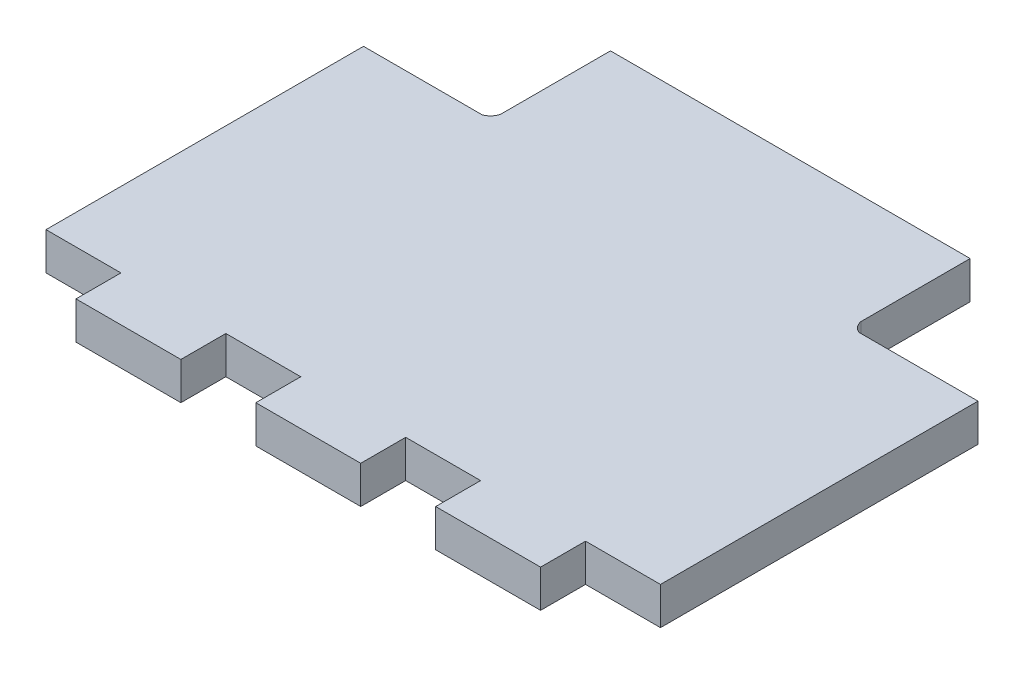
ISO-10303-21;
HEADER;
FILE_DESCRIPTION(('STEP AP214'),'2;1');
FILE_NAME('part.step','',(''),(''),'','','');
FILE_SCHEMA(('AUTOMOTIVE_DESIGN { 1 0 10303 214 1 1 1 1 }'));
ENDSEC;
DATA;
#1=APPLICATION_CONTEXT('core data for automotive mechanical design processes');
#2=APPLICATION_PROTOCOL_DEFINITION('international standard','automotive_design',2000,#1);
#3=PRODUCT_CONTEXT('',#1,'mechanical');
#4=PRODUCT('Part','Part','',(#3));
#5=PRODUCT_RELATED_PRODUCT_CATEGORY('part','',(#4));
#6=PRODUCT_DEFINITION_FORMATION('','',#4);
#7=PRODUCT_DEFINITION_CONTEXT('part definition',#1,'design');
#8=PRODUCT_DEFINITION('design','',#6,#7);
#9=PRODUCT_DEFINITION_SHAPE('','',#8);
#10=(LENGTH_UNIT() NAMED_UNIT(*) SI_UNIT(.MILLI.,.METRE.));
#11=(NAMED_UNIT(*) PLANE_ANGLE_UNIT() SI_UNIT($,.RADIAN.));
#12=(NAMED_UNIT(*) SI_UNIT($,.STERADIAN.) SOLID_ANGLE_UNIT());
#13=UNCERTAINTY_MEASURE_WITH_UNIT(LENGTH_MEASURE(1.E-05),#10,'distance_accuracy_value','');
#14=(GEOMETRIC_REPRESENTATION_CONTEXT(3) GLOBAL_UNCERTAINTY_ASSIGNED_CONTEXT((#13)) GLOBAL_UNIT_ASSIGNED_CONTEXT((#10,
#11,#12)) REPRESENTATION_CONTEXT('',''));
#15=CARTESIAN_POINT('',(0.,0.,0.));
#16=DIRECTION('',(0.,0.,1.));
#17=DIRECTION('',(1.,0.,0.));
#18=AXIS2_PLACEMENT_3D('',#15,#16,#17);
#19=CARTESIAN_POINT('',(-30.5196355348058,0.,-65.6826441034323));
#20=DIRECTION('',(0.,1.,0.));
#21=DIRECTION('',(0.,0.,1.));
#22=AXIS2_PLACEMENT_3D('',#19,#20,#21);
#23=PLANE('',#22);
#24=CARTESIAN_POINT('',(0.,0.,-35.3804974607344));
#25=DIRECTION('',(0.,1.,0.));
#26=DIRECTION('',(0.,0.,1.));
#27=AXIS2_PLACEMENT_3D('',#24,#25,#26);
#28=CIRCLE('',#27,5.);
#29=CARTESIAN_POINT('',(0.,0.,-30.3804974607344));
#30=VERTEX_POINT('',#29);
#31=EDGE_CURVE('E365',#30,#30,#28,.T.);
#32=ORIENTED_EDGE('',*,*,#31,.T.);
#33=EDGE_LOOP('',(#32));
#34=FACE_BOUND('',#33,.T.);
#35=DIRECTION('',(1.,0.,0.));
#36=VECTOR('',#35,1.);
#37=CARTESIAN_POINT('',(-60.9148213836601,0.,-62.2177754283308));
#38=LINE('',#37,#36);
#39=CARTESIAN_POINT('',(-60.9148213836601,0.,-62.2177754283308));
#40=VERTEX_POINT('',#39);
#41=CARTESIAN_POINT('',(-29.2216813505988,0.,-62.2177754283308));
#42=VERTEX_POINT('',#41);
#43=EDGE_CURVE('E215',#40,#42,#38,.T.);
#44=ORIENTED_EDGE('',*,*,#43,.T.);
#45=CARTESIAN_POINT('',(-30.5196355348058,0.,-65.6826441034323));
#46=DIRECTION('',(0.,1.,0.));
#47=DIRECTION('',(0.,0.,1.));
#48=AXIS2_PLACEMENT_3D('',#45,#46,#47);
#49=CIRCLE('',#48,3.7);
#50=CARTESIAN_POINT('',(-26.9148213836601,0.,-64.8487886389185));
#51=VERTEX_POINT('',#50);
#52=EDGE_CURVE('E218',#42,#51,#49,.T.);
#53=ORIENTED_EDGE('',*,*,#52,.T.);
#54=DIRECTION('',(0.,0.,-1.));
#55=VECTOR('',#54,1.);
#56=CARTESIAN_POINT('',(-26.9148213836601,0.,-64.8487886389185));
#57=LINE('',#56,#55);
#58=CARTESIAN_POINT('',(-26.9148213836601,0.,-94.1276666289056));
#59=VERTEX_POINT('',#58);
#60=EDGE_CURVE('E222',#51,#59,#57,.T.);
#61=ORIENTED_EDGE('',*,*,#60,.T.);
#62=DIRECTION('',(1.,0.,0.));
#63=VECTOR('',#62,1.);
#64=CARTESIAN_POINT('',(-26.9148213836601,0.,-94.1276666289056));
#65=LINE('',#64,#63);
#66=CARTESIAN_POINT('',(69.0851786163399,0.,-94.1276666289056));
#67=VERTEX_POINT('',#66);
#68=EDGE_CURVE('E225',#59,#67,#65,.T.);
#69=ORIENTED_EDGE('',*,*,#68,.T.);
#70=DIRECTION('',(0.,0.,-1.));
#71=VECTOR('',#70,1.);
#72=CARTESIAN_POINT('',(69.0851786163399,0.,-64.9385442389831));
#73=LINE('',#72,#71);
#74=CARTESIAN_POINT('',(69.0851786163399,0.,-64.9385442389831));
#75=VERTEX_POINT('',#74);
#76=EDGE_CURVE('E228',#75,#67,#73,.T.);
#77=ORIENTED_EDGE('',*,*,#76,.F.);
#78=CARTESIAN_POINT('',(72.7148304269141,0.,-65.6566164735081));
#79=DIRECTION('',(0.,1.,0.));
#80=DIRECTION('',(0.,0.,1.));
#81=AXIS2_PLACEMENT_3D('',#78,#79,#80);
#82=CIRCLE('',#81,3.7);
#83=CARTESIAN_POINT('',(71.349410247627,0.,-62.2177754283308));
#84=VERTEX_POINT('',#83);
#85=EDGE_CURVE('E231',#75,#84,#82,.T.);
#86=ORIENTED_EDGE('',*,*,#85,.T.);
#87=DIRECTION('',(-1.,0.,0.));
#88=VECTOR('',#87,1.);
#89=CARTESIAN_POINT('',(103.08517861634,0.,-62.2177754283308));
#90=LINE('',#89,#88);
#91=CARTESIAN_POINT('',(103.08517861634,0.,-62.2177754283308));
#92=VERTEX_POINT('',#91);
#93=EDGE_CURVE('E234',#92,#84,#90,.T.);
#94=ORIENTED_EDGE('',*,*,#93,.F.);
#95=DIRECTION('',(0.,0.,1.));
#96=VECTOR('',#95,1.);
#97=CARTESIAN_POINT('',(103.08517861634,0.,-62.2177754283308));
#98=LINE('',#97,#96);
#99=CARTESIAN_POINT('',(103.08517861634,0.,22.5240314487596));
#100=VERTEX_POINT('',#99);
#101=EDGE_CURVE('E237',#92,#100,#98,.T.);
#102=ORIENTED_EDGE('',*,*,#101,.T.);
#103=DIRECTION('',(1.,0.,0.));
#104=VECTOR('',#103,1.);
#105=CARTESIAN_POINT('',(83.0851786163399,0.,22.5240314487596));
#106=LINE('',#105,#104);
#107=CARTESIAN_POINT('',(83.0851786163399,0.,22.5240314487596));
#108=VERTEX_POINT('',#107);
#109=EDGE_CURVE('E240',#108,#100,#106,.T.);
#110=ORIENTED_EDGE('',*,*,#109,.F.);
#111=DIRECTION('',(0.,0.,1.));
#112=VECTOR('',#111,1.);
#113=CARTESIAN_POINT('',(83.0851786163399,0.,22.5240314487596));
#114=LINE('',#113,#112);
#115=CARTESIAN_POINT('',(83.0851786163399,0.,34.5240314487596));
#116=VERTEX_POINT('',#115);
#117=EDGE_CURVE('E243',#108,#116,#114,.T.);
#118=ORIENTED_EDGE('',*,*,#117,.T.);
#119=DIRECTION('',(1.,0.,0.));
#120=VECTOR('',#119,1.);
#121=CARTESIAN_POINT('',(55.0851786163399,0.,34.5240314487596));
#122=LINE('',#121,#120);
#123=CARTESIAN_POINT('',(55.0851786163399,0.,34.5240314487596));
#124=VERTEX_POINT('',#123);
#125=EDGE_CURVE('E246',#124,#116,#122,.T.);
#126=ORIENTED_EDGE('',*,*,#125,.F.);
#127=DIRECTION('',(0.,0.,1.));
#128=VECTOR('',#127,1.);
#129=CARTESIAN_POINT('',(55.0851786163399,0.,22.5240314487596));
#130=LINE('',#129,#128);
#131=CARTESIAN_POINT('',(55.0851786163399,0.,22.5240314487596));
#132=VERTEX_POINT('',#131);
#133=EDGE_CURVE('E249',#132,#124,#130,.T.);
#134=ORIENTED_EDGE('',*,*,#133,.F.);
#135=DIRECTION('',(1.,0.,0.));
#136=VECTOR('',#135,1.);
#137=CARTESIAN_POINT('',(35.0851786163399,0.,22.5240314487596));
#138=LINE('',#137,#136);
#139=CARTESIAN_POINT('',(35.0851786163399,0.,22.5240314487596));
#140=VERTEX_POINT('',#139);
#141=EDGE_CURVE('E251',#140,#132,#138,.T.);
#142=ORIENTED_EDGE('',*,*,#141,.F.);
#143=DIRECTION('',(0.,0.,1.));
#144=VECTOR('',#143,1.);
#145=CARTESIAN_POINT('',(35.0851786163399,0.,22.5240314487596));
#146=LINE('',#145,#144);
#147=CARTESIAN_POINT('',(35.0851786163399,0.,34.5240314487596));
#148=VERTEX_POINT('',#147);
#149=EDGE_CURVE('E253',#140,#148,#146,.T.);
#150=ORIENTED_EDGE('',*,*,#149,.T.);
#151=DIRECTION('',(1.,0.,0.));
#152=VECTOR('',#151,1.);
#153=CARTESIAN_POINT('',(7.08517861633992,0.,34.5240314487596));
#154=LINE('',#153,#152);
#155=CARTESIAN_POINT('',(7.08517861633992,0.,34.5240314487596));
#156=VERTEX_POINT('',#155);
#157=EDGE_CURVE('E256',#156,#148,#154,.T.);
#158=ORIENTED_EDGE('',*,*,#157,.F.);
#159=DIRECTION('',(0.,0.,1.));
#160=VECTOR('',#159,1.);
#161=CARTESIAN_POINT('',(7.08517861633992,0.,22.5240314487596));
#162=LINE('',#161,#160);
#163=CARTESIAN_POINT('',(7.08517861633992,0.,22.5240314487596));
#164=VERTEX_POINT('',#163);
#165=EDGE_CURVE('E259',#164,#156,#162,.T.);
#166=ORIENTED_EDGE('',*,*,#165,.F.);
#167=DIRECTION('',(1.,0.,0.));
#168=VECTOR('',#167,1.);
#169=CARTESIAN_POINT('',(-12.9148213836601,0.,22.5240314487596));
#170=LINE('',#169,#168);
#171=CARTESIAN_POINT('',(-12.9148213836601,0.,22.5240314487596));
#172=VERTEX_POINT('',#171);
#173=EDGE_CURVE('E261',#172,#164,#170,.T.);
#174=ORIENTED_EDGE('',*,*,#173,.F.);
#175=DIRECTION('',(0.,0.,1.));
#176=VECTOR('',#175,1.);
#177=CARTESIAN_POINT('',(-12.9148213836601,0.,22.5240314487596));
#178=LINE('',#177,#176);
#179=CARTESIAN_POINT('',(-12.9148213836601,0.,34.5240314487597));
#180=VERTEX_POINT('',#179);
#181=EDGE_CURVE('E263',#172,#180,#178,.T.);
#182=ORIENTED_EDGE('',*,*,#181,.T.);
#183=DIRECTION('',(1.,0.,0.));
#184=VECTOR('',#183,1.);
#185=CARTESIAN_POINT('',(-40.9148213836601,0.,34.5240314487597));
#186=LINE('',#185,#184);
#187=CARTESIAN_POINT('',(-40.9148213836601,0.,34.5240314487597));
#188=VERTEX_POINT('',#187);
#189=EDGE_CURVE('E266',#188,#180,#186,.T.);
#190=ORIENTED_EDGE('',*,*,#189,.F.);
#191=DIRECTION('',(0.,0.,1.));
#192=VECTOR('',#191,1.);
#193=CARTESIAN_POINT('',(-40.9148213836601,0.,22.5240314487596));
#194=LINE('',#193,#192);
#195=CARTESIAN_POINT('',(-40.9148213836601,0.,22.5240314487596));
#196=VERTEX_POINT('',#195);
#197=EDGE_CURVE('E269',#196,#188,#194,.T.);
#198=ORIENTED_EDGE('',*,*,#197,.F.);
#199=DIRECTION('',(1.,0.,0.));
#200=VECTOR('',#199,1.);
#201=CARTESIAN_POINT('',(-60.9148213836601,0.,22.5240314487596));
#202=LINE('',#201,#200);
#203=CARTESIAN_POINT('',(-60.9148213836601,0.,22.5240314487596));
#204=VERTEX_POINT('',#203);
#205=EDGE_CURVE('E200',#204,#196,#202,.T.);
#206=ORIENTED_EDGE('',*,*,#205,.F.);
#207=DIRECTION('',(0.,0.,1.));
#208=VECTOR('',#207,1.);
#209=CARTESIAN_POINT('',(-60.9148213836601,0.,-62.2177754283308));
#210=LINE('',#209,#208);
#211=EDGE_CURVE('E120',#40,#204,#210,.T.);
#212=ORIENTED_EDGE('',*,*,#211,.F.);
#213=EDGE_LOOP('',(#44,#53,#61,#69,#77,#86,#94,#102,#110,#118,#126,#134,#142,#150,#158,#166,
#174,#182,#190,#198,#206,#212));
#214=FACE_BOUND('',#213,.T.);
#215=CARTESIAN_POINT('',(40.,0.,-35.3804974607344));
#216=DIRECTION('',(0.,1.,0.));
#217=DIRECTION('',(0.,0.,1.));
#218=AXIS2_PLACEMENT_3D('',#215,#216,#217);
#219=CIRCLE('',#218,5.);
#220=CARTESIAN_POINT('',(40.,0.,-30.3804974607344));
#221=VERTEX_POINT('',#220);
#222=EDGE_CURVE('E368',#221,#221,#219,.T.);
#223=ORIENTED_EDGE('',*,*,#222,.T.);
#224=EDGE_LOOP('',(#223));
#225=FACE_BOUND('',#224,.T.);
#226=ADVANCED_FACE('F32',(#34,#214,#225),#23,.F.);
#227=CARTESIAN_POINT('',(-60.9148213836601,10.,-62.2177754283308));
#228=DIRECTION('',(0.,0.,-1.));
#229=DIRECTION('',(-1.,0.,0.));
#230=AXIS2_PLACEMENT_3D('',#227,#228,#229);
#231=PLANE('',#230);
#232=ORIENTED_EDGE('',*,*,#43,.F.);
#233=DIRECTION('',(0.,-1.,0.));
#234=VECTOR('',#233,1.);
#235=CARTESIAN_POINT('',(-60.9148213836601,10.,-62.2177754283308));
#236=LINE('',#235,#234);
#237=CARTESIAN_POINT('',(-60.9148213836601,10.,-62.2177754283308));
#238=VERTEX_POINT('',#237);
#239=EDGE_CURVE('E11',#238,#40,#236,.T.);
#240=ORIENTED_EDGE('',*,*,#239,.F.);
#241=DIRECTION('',(1.,0.,0.));
#242=VECTOR('',#241,1.);
#243=CARTESIAN_POINT('',(-60.9148213836601,10.,-62.2177754283308));
#244=LINE('',#243,#242);
#245=CARTESIAN_POINT('',(-29.2216813505988,10.,-62.2177754283308));
#246=VERTEX_POINT('',#245);
#247=EDGE_CURVE('E272',#238,#246,#244,.T.);
#248=ORIENTED_EDGE('',*,*,#247,.T.);
#249=DIRECTION('',(0.,-1.,0.));
#250=VECTOR('',#249,1.);
#251=CARTESIAN_POINT('',(-29.2216813505988,10.,-62.2177754283308));
#252=LINE('',#251,#250);
#253=EDGE_CURVE('E36',#246,#42,#252,.T.);
#254=ORIENTED_EDGE('',*,*,#253,.T.);
#255=EDGE_LOOP('',(#232,#240,#248,#254));
#256=FACE_BOUND('',#255,.T.);
#257=ADVANCED_FACE('F34',(#256),#231,.T.);
#258=CARTESIAN_POINT('',(-60.9148213836601,10.,-62.2177754283308));
#259=DIRECTION('',(1.,0.,0.));
#260=DIRECTION('',(0.,0.,-1.));
#261=AXIS2_PLACEMENT_3D('',#258,#259,#260);
#262=PLANE('',#261);
#263=ORIENTED_EDGE('',*,*,#211,.T.);
#264=DIRECTION('',(0.,-1.,0.));
#265=VECTOR('',#264,1.);
#266=CARTESIAN_POINT('',(-60.9148213836601,10.,22.5240314487596));
#267=LINE('',#266,#265);
#268=CARTESIAN_POINT('',(-60.9148213836601,10.,22.5240314487596));
#269=VERTEX_POINT('',#268);
#270=EDGE_CURVE('E42',#269,#204,#267,.T.);
#271=ORIENTED_EDGE('',*,*,#270,.F.);
#272=DIRECTION('',(0.,0.,1.));
#273=VECTOR('',#272,1.);
#274=CARTESIAN_POINT('',(-60.9148213836601,10.,-62.2177754283308));
#275=LINE('',#274,#273);
#276=EDGE_CURVE('E193',#238,#269,#275,.T.);
#277=ORIENTED_EDGE('',*,*,#276,.F.);
#278=ORIENTED_EDGE('',*,*,#239,.T.);
#279=EDGE_LOOP('',(#263,#271,#277,#278));
#280=FACE_BOUND('',#279,.T.);
#281=ADVANCED_FACE('F398',(#280),#262,.F.);
#282=CARTESIAN_POINT('',(-60.9148213836601,10.,22.5240314487596));
#283=DIRECTION('',(0.,0.,-1.));
#284=DIRECTION('',(-1.,0.,0.));
#285=AXIS2_PLACEMENT_3D('',#282,#283,#284);
#286=PLANE('',#285);
#287=ORIENTED_EDGE('',*,*,#205,.T.);
#288=DIRECTION('',(0.,-1.,0.));
#289=VECTOR('',#288,1.);
#290=CARTESIAN_POINT('',(-40.9148213836601,10.,22.5240314487596));
#291=LINE('',#290,#289);
#292=CARTESIAN_POINT('',(-40.9148213836601,10.,22.5240314487596));
#293=VERTEX_POINT('',#292);
#294=EDGE_CURVE('E197',#293,#196,#291,.T.);
#295=ORIENTED_EDGE('',*,*,#294,.F.);
#296=DIRECTION('',(1.,0.,0.));
#297=VECTOR('',#296,1.);
#298=CARTESIAN_POINT('',(-60.9148213836601,10.,22.5240314487596));
#299=LINE('',#298,#297);
#300=EDGE_CURVE('E186',#269,#293,#299,.T.);
#301=ORIENTED_EDGE('',*,*,#300,.F.);
#302=ORIENTED_EDGE('',*,*,#270,.T.);
#303=EDGE_LOOP('',(#287,#295,#301,#302));
#304=FACE_BOUND('',#303,.T.);
#305=ADVANCED_FACE('F198',(#304),#286,.F.);
#306=CARTESIAN_POINT('',(-40.9148213836601,10.,22.5240314487596));
#307=DIRECTION('',(1.,0.,0.));
#308=DIRECTION('',(0.,0.,-1.));
#309=AXIS2_PLACEMENT_3D('',#306,#307,#308);
#310=PLANE('',#309);
#311=ORIENTED_EDGE('',*,*,#197,.T.);
#312=DIRECTION('',(0.,-1.,0.));
#313=VECTOR('',#312,1.);
#314=CARTESIAN_POINT('',(-40.9148213836601,10.,34.5240314487597));
#315=LINE('',#314,#313);
#316=CARTESIAN_POINT('',(-40.9148213836601,10.,34.5240314487597));
#317=VERTEX_POINT('',#316);
#318=EDGE_CURVE('E203',#317,#188,#315,.T.);
#319=ORIENTED_EDGE('',*,*,#318,.F.);
#320=DIRECTION('',(0.,0.,1.));
#321=VECTOR('',#320,1.);
#322=CARTESIAN_POINT('',(-40.9148213836601,10.,22.5240314487596));
#323=LINE('',#322,#321);
#324=EDGE_CURVE('E191',#293,#317,#323,.T.);
#325=ORIENTED_EDGE('',*,*,#324,.F.);
#326=ORIENTED_EDGE('',*,*,#294,.T.);
#327=EDGE_LOOP('',(#311,#319,#325,#326));
#328=FACE_BOUND('',#327,.T.);
#329=ADVANCED_FACE('F205',(#328),#310,.F.);
#330=CARTESIAN_POINT('',(-40.9148213836601,10.,34.5240314487597));
#331=DIRECTION('',(0.,0.,-1.));
#332=DIRECTION('',(-1.,0.,0.));
#333=AXIS2_PLACEMENT_3D('',#330,#331,#332);
#334=PLANE('',#333);
#335=ORIENTED_EDGE('',*,*,#189,.T.);
#336=DIRECTION('',(0.,-1.,0.));
#337=VECTOR('',#336,1.);
#338=CARTESIAN_POINT('',(-12.9148213836601,10.,34.5240314487597));
#339=LINE('',#338,#337);
#340=CARTESIAN_POINT('',(-12.9148213836601,10.,34.5240314487597));
#341=VERTEX_POINT('',#340);
#342=EDGE_CURVE('E276',#341,#180,#339,.T.);
#343=ORIENTED_EDGE('',*,*,#342,.F.);
#344=DIRECTION('',(1.,0.,0.));
#345=VECTOR('',#344,1.);
#346=CARTESIAN_POINT('',(-40.9148213836601,10.,34.5240314487597));
#347=LINE('',#346,#345);
#348=EDGE_CURVE('E208',#317,#341,#347,.T.);
#349=ORIENTED_EDGE('',*,*,#348,.F.);
#350=ORIENTED_EDGE('',*,*,#318,.T.);
#351=EDGE_LOOP('',(#335,#343,#349,#350));
#352=FACE_BOUND('',#351,.T.);
#353=ADVANCED_FACE('F318',(#352),#334,.F.);
#354=CARTESIAN_POINT('',(-12.9148213836601,10.,22.5240314487596));
#355=DIRECTION('',(1.,0.,0.));
#356=DIRECTION('',(0.,0.,-1.));
#357=AXIS2_PLACEMENT_3D('',#354,#355,#356);
#358=PLANE('',#357);
#359=ORIENTED_EDGE('',*,*,#181,.F.);
#360=DIRECTION('',(0.,-1.,0.));
#361=VECTOR('',#360,1.);
#362=CARTESIAN_POINT('',(-12.9148213836601,10.,22.5240314487596));
#363=LINE('',#362,#361);
#364=CARTESIAN_POINT('',(-12.9148213836601,10.,22.5240314487596));
#365=VERTEX_POINT('',#364);
#366=EDGE_CURVE('E278',#365,#172,#363,.T.);
#367=ORIENTED_EDGE('',*,*,#366,.F.);
#368=DIRECTION('',(0.,0.,1.));
#369=VECTOR('',#368,1.);
#370=CARTESIAN_POINT('',(-12.9148213836601,10.,22.5240314487596));
#371=LINE('',#370,#369);
#372=EDGE_CURVE('E210',#365,#341,#371,.T.);
#373=ORIENTED_EDGE('',*,*,#372,.T.);
#374=ORIENTED_EDGE('',*,*,#342,.T.);
#375=EDGE_LOOP('',(#359,#367,#373,#374));
#376=FACE_BOUND('',#375,.T.);
#377=ADVANCED_FACE('F410',(#376),#358,.T.);
#378=CARTESIAN_POINT('',(-12.9148213836601,10.,22.5240314487596));
#379=DIRECTION('',(0.,0.,-1.));
#380=DIRECTION('',(-1.,0.,0.));
#381=AXIS2_PLACEMENT_3D('',#378,#379,#380);
#382=PLANE('',#381);
#383=ORIENTED_EDGE('',*,*,#173,.T.);
#384=DIRECTION('',(0.,-1.,0.));
#385=VECTOR('',#384,1.);
#386=CARTESIAN_POINT('',(7.08517861633992,10.,22.5240314487596));
#387=LINE('',#386,#385);
#388=CARTESIAN_POINT('',(7.08517861633992,10.,22.5240314487596));
#389=VERTEX_POINT('',#388);
#390=EDGE_CURVE('E280',#389,#164,#387,.T.);
#391=ORIENTED_EDGE('',*,*,#390,.F.);
#392=DIRECTION('',(1.,0.,0.));
#393=VECTOR('',#392,1.);
#394=CARTESIAN_POINT('',(-12.9148213836601,10.,22.5240314487596));
#395=LINE('',#394,#393);
#396=EDGE_CURVE('E323',#365,#389,#395,.T.);
#397=ORIENTED_EDGE('',*,*,#396,.F.);
#398=ORIENTED_EDGE('',*,*,#366,.T.);
#399=EDGE_LOOP('',(#383,#391,#397,#398));
#400=FACE_BOUND('',#399,.T.);
#401=ADVANCED_FACE('F413',(#400),#382,.F.);
#402=CARTESIAN_POINT('',(7.08517861633992,10.,22.5240314487596));
#403=DIRECTION('',(1.,0.,0.));
#404=DIRECTION('',(0.,0.,-1.));
#405=AXIS2_PLACEMENT_3D('',#402,#403,#404);
#406=PLANE('',#405);
#407=ORIENTED_EDGE('',*,*,#165,.T.);
#408=DIRECTION('',(0.,-1.,0.));
#409=VECTOR('',#408,1.);
#410=CARTESIAN_POINT('',(7.08517861633992,10.,34.5240314487596));
#411=LINE('',#410,#409);
#412=CARTESIAN_POINT('',(7.08517861633992,10.,34.5240314487596));
#413=VERTEX_POINT('',#412);
#414=EDGE_CURVE('E283',#413,#156,#411,.T.);
#415=ORIENTED_EDGE('',*,*,#414,.F.);
#416=DIRECTION('',(0.,0.,1.));
#417=VECTOR('',#416,1.);
#418=CARTESIAN_POINT('',(7.08517861633992,10.,22.5240314487596));
#419=LINE('',#418,#417);
#420=EDGE_CURVE('E326',#389,#413,#419,.T.);
#421=ORIENTED_EDGE('',*,*,#420,.F.);
#422=ORIENTED_EDGE('',*,*,#390,.T.);
#423=EDGE_LOOP('',(#407,#415,#421,#422));
#424=FACE_BOUND('',#423,.T.);
#425=ADVANCED_FACE('F416',(#424),#406,.F.);
#426=CARTESIAN_POINT('',(7.08517861633992,10.,34.5240314487596));
#427=DIRECTION('',(0.,0.,-1.));
#428=DIRECTION('',(-1.,0.,0.));
#429=AXIS2_PLACEMENT_3D('',#426,#427,#428);
#430=PLANE('',#429);
#431=ORIENTED_EDGE('',*,*,#157,.T.);
#432=DIRECTION('',(0.,-1.,0.));
#433=VECTOR('',#432,1.);
#434=CARTESIAN_POINT('',(35.0851786163399,10.,34.5240314487596));
#435=LINE('',#434,#433);
#436=CARTESIAN_POINT('',(35.0851786163399,10.,34.5240314487596));
#437=VERTEX_POINT('',#436);
#438=EDGE_CURVE('E286',#437,#148,#435,.T.);
#439=ORIENTED_EDGE('',*,*,#438,.F.);
#440=DIRECTION('',(1.,0.,0.));
#441=VECTOR('',#440,1.);
#442=CARTESIAN_POINT('',(7.08517861633992,10.,34.5240314487596));
#443=LINE('',#442,#441);
#444=EDGE_CURVE('E330',#413,#437,#443,.T.);
#445=ORIENTED_EDGE('',*,*,#444,.F.);
#446=ORIENTED_EDGE('',*,*,#414,.T.);
#447=EDGE_LOOP('',(#431,#439,#445,#446));
#448=FACE_BOUND('',#447,.T.);
#449=ADVANCED_FACE('F420',(#448),#430,.F.);
#450=CARTESIAN_POINT('',(35.0851786163399,10.,22.5240314487596));
#451=DIRECTION('',(1.,0.,0.));
#452=DIRECTION('',(0.,0.,-1.));
#453=AXIS2_PLACEMENT_3D('',#450,#451,#452);
#454=PLANE('',#453);
#455=ORIENTED_EDGE('',*,*,#149,.F.);
#456=DIRECTION('',(0.,-1.,0.));
#457=VECTOR('',#456,1.);
#458=CARTESIAN_POINT('',(35.0851786163399,10.,22.5240314487596));
#459=LINE('',#458,#457);
#460=CARTESIAN_POINT('',(35.0851786163399,10.,22.5240314487596));
#461=VERTEX_POINT('',#460);
#462=EDGE_CURVE('E288',#461,#140,#459,.T.);
#463=ORIENTED_EDGE('',*,*,#462,.F.);
#464=DIRECTION('',(0.,0.,1.));
#465=VECTOR('',#464,1.);
#466=CARTESIAN_POINT('',(35.0851786163399,10.,22.5240314487596));
#467=LINE('',#466,#465);
#468=EDGE_CURVE('E332',#461,#437,#467,.T.);
#469=ORIENTED_EDGE('',*,*,#468,.T.);
#470=ORIENTED_EDGE('',*,*,#438,.T.);
#471=EDGE_LOOP('',(#455,#463,#469,#470));
#472=FACE_BOUND('',#471,.T.);
#473=ADVANCED_FACE('F424',(#472),#454,.T.);
#474=CARTESIAN_POINT('',(35.0851786163399,10.,22.5240314487596));
#475=DIRECTION('',(0.,0.,-1.));
#476=DIRECTION('',(-1.,0.,0.));
#477=AXIS2_PLACEMENT_3D('',#474,#475,#476);
#478=PLANE('',#477);
#479=ORIENTED_EDGE('',*,*,#141,.T.);
#480=DIRECTION('',(0.,-1.,0.));
#481=VECTOR('',#480,1.);
#482=CARTESIAN_POINT('',(55.0851786163399,10.,22.5240314487596));
#483=LINE('',#482,#481);
#484=CARTESIAN_POINT('',(55.0851786163399,10.,22.5240314487596));
#485=VERTEX_POINT('',#484);
#486=EDGE_CURVE('E290',#485,#132,#483,.T.);
#487=ORIENTED_EDGE('',*,*,#486,.F.);
#488=DIRECTION('',(1.,0.,0.));
#489=VECTOR('',#488,1.);
#490=CARTESIAN_POINT('',(35.0851786163399,10.,22.5240314487596));
#491=LINE('',#490,#489);
#492=EDGE_CURVE('E335',#461,#485,#491,.T.);
#493=ORIENTED_EDGE('',*,*,#492,.F.);
#494=ORIENTED_EDGE('',*,*,#462,.T.);
#495=EDGE_LOOP('',(#479,#487,#493,#494));
#496=FACE_BOUND('',#495,.T.);
#497=ADVANCED_FACE('F428',(#496),#478,.F.);
#498=CARTESIAN_POINT('',(55.0851786163399,10.,22.5240314487596));
#499=DIRECTION('',(1.,0.,0.));
#500=DIRECTION('',(0.,0.,-1.));
#501=AXIS2_PLACEMENT_3D('',#498,#499,#500);
#502=PLANE('',#501);
#503=ORIENTED_EDGE('',*,*,#133,.T.);
#504=DIRECTION('',(0.,-1.,0.));
#505=VECTOR('',#504,1.);
#506=CARTESIAN_POINT('',(55.0851786163399,10.,34.5240314487596));
#507=LINE('',#506,#505);
#508=CARTESIAN_POINT('',(55.0851786163399,10.,34.5240314487596));
#509=VERTEX_POINT('',#508);
#510=EDGE_CURVE('E293',#509,#124,#507,.T.);
#511=ORIENTED_EDGE('',*,*,#510,.F.);
#512=DIRECTION('',(0.,0.,1.));
#513=VECTOR('',#512,1.);
#514=CARTESIAN_POINT('',(55.0851786163399,10.,22.5240314487596));
#515=LINE('',#514,#513);
#516=EDGE_CURVE('E337',#485,#509,#515,.T.);
#517=ORIENTED_EDGE('',*,*,#516,.F.);
#518=ORIENTED_EDGE('',*,*,#486,.T.);
#519=EDGE_LOOP('',(#503,#511,#517,#518));
#520=FACE_BOUND('',#519,.T.);
#521=ADVANCED_FACE('F432',(#520),#502,.F.);
#522=CARTESIAN_POINT('',(55.0851786163399,10.,34.5240314487596));
#523=DIRECTION('',(0.,0.,-1.));
#524=DIRECTION('',(-1.,0.,0.));
#525=AXIS2_PLACEMENT_3D('',#522,#523,#524);
#526=PLANE('',#525);
#527=ORIENTED_EDGE('',*,*,#125,.T.);
#528=DIRECTION('',(0.,-1.,0.));
#529=VECTOR('',#528,1.);
#530=CARTESIAN_POINT('',(83.0851786163399,10.,34.5240314487596));
#531=LINE('',#530,#529);
#532=CARTESIAN_POINT('',(83.0851786163399,10.,34.5240314487596));
#533=VERTEX_POINT('',#532);
#534=EDGE_CURVE('E296',#533,#116,#531,.T.);
#535=ORIENTED_EDGE('',*,*,#534,.F.);
#536=DIRECTION('',(1.,0.,0.));
#537=VECTOR('',#536,1.);
#538=CARTESIAN_POINT('',(55.0851786163399,10.,34.5240314487596));
#539=LINE('',#538,#537);
#540=EDGE_CURVE('E339',#509,#533,#539,.T.);
#541=ORIENTED_EDGE('',*,*,#540,.F.);
#542=ORIENTED_EDGE('',*,*,#510,.T.);
#543=EDGE_LOOP('',(#527,#535,#541,#542));
#544=FACE_BOUND('',#543,.T.);
#545=ADVANCED_FACE('F436',(#544),#526,.F.);
#546=CARTESIAN_POINT('',(83.0851786163399,10.,22.5240314487596));
#547=DIRECTION('',(1.,0.,0.));
#548=DIRECTION('',(0.,0.,-1.));
#549=AXIS2_PLACEMENT_3D('',#546,#547,#548);
#550=PLANE('',#549);
#551=ORIENTED_EDGE('',*,*,#117,.F.);
#552=DIRECTION('',(0.,-1.,0.));
#553=VECTOR('',#552,1.);
#554=CARTESIAN_POINT('',(83.0851786163399,10.,22.5240314487596));
#555=LINE('',#554,#553);
#556=CARTESIAN_POINT('',(83.0851786163399,10.,22.5240314487596));
#557=VERTEX_POINT('',#556);
#558=EDGE_CURVE('E298',#557,#108,#555,.T.);
#559=ORIENTED_EDGE('',*,*,#558,.F.);
#560=DIRECTION('',(0.,0.,1.));
#561=VECTOR('',#560,1.);
#562=CARTESIAN_POINT('',(83.0851786163399,10.,22.5240314487596));
#563=LINE('',#562,#561);
#564=EDGE_CURVE('E341',#557,#533,#563,.T.);
#565=ORIENTED_EDGE('',*,*,#564,.T.);
#566=ORIENTED_EDGE('',*,*,#534,.T.);
#567=EDGE_LOOP('',(#551,#559,#565,#566));
#568=FACE_BOUND('',#567,.T.);
#569=ADVANCED_FACE('F440',(#568),#550,.T.);
#570=CARTESIAN_POINT('',(83.0851786163399,10.,22.5240314487596));
#571=DIRECTION('',(0.,0.,-1.));
#572=DIRECTION('',(-1.,0.,0.));
#573=AXIS2_PLACEMENT_3D('',#570,#571,#572);
#574=PLANE('',#573);
#575=ORIENTED_EDGE('',*,*,#109,.T.);
#576=DIRECTION('',(0.,-1.,0.));
#577=VECTOR('',#576,1.);
#578=CARTESIAN_POINT('',(103.08517861634,10.,22.5240314487596));
#579=LINE('',#578,#577);
#580=CARTESIAN_POINT('',(103.08517861634,10.,22.5240314487596));
#581=VERTEX_POINT('',#580);
#582=EDGE_CURVE('E300',#581,#100,#579,.T.);
#583=ORIENTED_EDGE('',*,*,#582,.F.);
#584=DIRECTION('',(1.,0.,0.));
#585=VECTOR('',#584,1.);
#586=CARTESIAN_POINT('',(83.0851786163399,10.,22.5240314487596));
#587=LINE('',#586,#585);
#588=EDGE_CURVE('E344',#557,#581,#587,.T.);
#589=ORIENTED_EDGE('',*,*,#588,.F.);
#590=ORIENTED_EDGE('',*,*,#558,.T.);
#591=EDGE_LOOP('',(#575,#583,#589,#590));
#592=FACE_BOUND('',#591,.T.);
#593=ADVANCED_FACE('F444',(#592),#574,.F.);
#594=CARTESIAN_POINT('',(103.08517861634,10.,-62.2177754283308));
#595=DIRECTION('',(1.,0.,0.));
#596=DIRECTION('',(0.,0.,-1.));
#597=AXIS2_PLACEMENT_3D('',#594,#595,#596);
#598=PLANE('',#597);
#599=ORIENTED_EDGE('',*,*,#101,.F.);
#600=DIRECTION('',(0.,-1.,0.));
#601=VECTOR('',#600,1.);
#602=CARTESIAN_POINT('',(103.08517861634,10.,-62.2177754283308));
#603=LINE('',#602,#601);
#604=CARTESIAN_POINT('',(103.08517861634,10.,-62.2177754283308));
#605=VERTEX_POINT('',#604);
#606=EDGE_CURVE('E302',#605,#92,#603,.T.);
#607=ORIENTED_EDGE('',*,*,#606,.F.);
#608=DIRECTION('',(0.,0.,1.));
#609=VECTOR('',#608,1.);
#610=CARTESIAN_POINT('',(103.08517861634,10.,-62.2177754283308));
#611=LINE('',#610,#609);
#612=EDGE_CURVE('E346',#605,#581,#611,.T.);
#613=ORIENTED_EDGE('',*,*,#612,.T.);
#614=ORIENTED_EDGE('',*,*,#582,.T.);
#615=EDGE_LOOP('',(#599,#607,#613,#614));
#616=FACE_BOUND('',#615,.T.);
#617=ADVANCED_FACE('F448',(#616),#598,.T.);
#618=CARTESIAN_POINT('',(103.08517861634,10.,-62.2177754283308));
#619=DIRECTION('',(0.,0.,1.));
#620=DIRECTION('',(1.,0.,0.));
#621=AXIS2_PLACEMENT_3D('',#618,#619,#620);
#622=PLANE('',#621);
#623=ORIENTED_EDGE('',*,*,#93,.T.);
#624=DIRECTION('',(0.,-1.,0.));
#625=VECTOR('',#624,1.);
#626=CARTESIAN_POINT('',(71.349410247627,10.,-62.2177754283308));
#627=LINE('',#626,#625);
#628=CARTESIAN_POINT('',(71.349410247627,10.,-62.2177754283308));
#629=VERTEX_POINT('',#628);
#630=EDGE_CURVE('E304',#629,#84,#627,.T.);
#631=ORIENTED_EDGE('',*,*,#630,.F.);
#632=DIRECTION('',(-1.,0.,0.));
#633=VECTOR('',#632,1.);
#634=CARTESIAN_POINT('',(103.08517861634,10.,-62.2177754283308));
#635=LINE('',#634,#633);
#636=EDGE_CURVE('E349',#605,#629,#635,.T.);
#637=ORIENTED_EDGE('',*,*,#636,.F.);
#638=ORIENTED_EDGE('',*,*,#606,.T.);
#639=EDGE_LOOP('',(#623,#631,#637,#638));
#640=FACE_BOUND('',#639,.T.);
#641=ADVANCED_FACE('F452',(#640),#622,.F.);
#642=CARTESIAN_POINT('',(72.7148304269141,10.,-65.6566164735081));
#643=DIRECTION('',(0.,-1.,0.));
#644=DIRECTION('',(0.,0.,-1.));
#645=AXIS2_PLACEMENT_3D('',#642,#643,#644);
#646=CYLINDRICAL_SURFACE('',#645,3.7);
#647=ORIENTED_EDGE('',*,*,#85,.F.);
#648=DIRECTION('',(0.,-1.,0.));
#649=VECTOR('',#648,1.);
#650=CARTESIAN_POINT('',(69.0851786163399,10.,-64.9385442389831));
#651=LINE('',#650,#649);
#652=CARTESIAN_POINT('',(69.0851786163399,10.,-64.9385442389831));
#653=VERTEX_POINT('',#652);
#654=EDGE_CURVE('E306',#653,#75,#651,.T.);
#655=ORIENTED_EDGE('',*,*,#654,.F.);
#656=CARTESIAN_POINT('',(72.7148304269141,10.,-65.6566164735081));
#657=DIRECTION('',(0.,1.,0.));
#658=DIRECTION('',(0.,0.,1.));
#659=AXIS2_PLACEMENT_3D('',#656,#657,#658);
#660=CIRCLE('',#659,3.7);
#661=EDGE_CURVE('E351',#653,#629,#660,.T.);
#662=ORIENTED_EDGE('',*,*,#661,.T.);
#663=ORIENTED_EDGE('',*,*,#630,.T.);
#664=EDGE_LOOP('',(#647,#655,#662,#663));
#665=FACE_BOUND('',#664,.T.);
#666=ADVANCED_FACE('F456',(#665),#646,.F.);
#667=CARTESIAN_POINT('',(69.0851786163399,10.,-64.9385442389831));
#668=DIRECTION('',(-1.,0.,0.));
#669=DIRECTION('',(0.,0.,1.));
#670=AXIS2_PLACEMENT_3D('',#667,#668,#669);
#671=PLANE('',#670);
#672=ORIENTED_EDGE('',*,*,#76,.T.);
#673=DIRECTION('',(0.,-1.,0.));
#674=VECTOR('',#673,1.);
#675=CARTESIAN_POINT('',(69.0851786163399,10.,-94.1276666289056));
#676=LINE('',#675,#674);
#677=CARTESIAN_POINT('',(69.0851786163399,10.,-94.1276666289056));
#678=VERTEX_POINT('',#677);
#679=EDGE_CURVE('E308',#678,#67,#676,.T.);
#680=ORIENTED_EDGE('',*,*,#679,.F.);
#681=DIRECTION('',(0.,0.,-1.));
#682=VECTOR('',#681,1.);
#683=CARTESIAN_POINT('',(69.0851786163399,10.,-64.9385442389831));
#684=LINE('',#683,#682);
#685=EDGE_CURVE('E354',#653,#678,#684,.T.);
#686=ORIENTED_EDGE('',*,*,#685,.F.);
#687=ORIENTED_EDGE('',*,*,#654,.T.);
#688=EDGE_LOOP('',(#672,#680,#686,#687));
#689=FACE_BOUND('',#688,.T.);
#690=ADVANCED_FACE('F460',(#689),#671,.F.);
#691=CARTESIAN_POINT('',(-26.9148213836601,10.,-94.1276666289056));
#692=DIRECTION('',(0.,0.,-1.));
#693=DIRECTION('',(-1.,0.,0.));
#694=AXIS2_PLACEMENT_3D('',#691,#692,#693);
#695=PLANE('',#694);
#696=ORIENTED_EDGE('',*,*,#68,.F.);
#697=DIRECTION('',(0.,-1.,0.));
#698=VECTOR('',#697,1.);
#699=CARTESIAN_POINT('',(-26.9148213836601,10.,-94.1276666289056));
#700=LINE('',#699,#698);
#701=CARTESIAN_POINT('',(-26.9148213836601,10.,-94.1276666289056));
#702=VERTEX_POINT('',#701);
#703=EDGE_CURVE('E310',#702,#59,#700,.T.);
#704=ORIENTED_EDGE('',*,*,#703,.F.);
#705=DIRECTION('',(1.,0.,0.));
#706=VECTOR('',#705,1.);
#707=CARTESIAN_POINT('',(-26.9148213836601,10.,-94.1276666289056));
#708=LINE('',#707,#706);
#709=EDGE_CURVE('E356',#702,#678,#708,.T.);
#710=ORIENTED_EDGE('',*,*,#709,.T.);
#711=ORIENTED_EDGE('',*,*,#679,.T.);
#712=EDGE_LOOP('',(#696,#704,#710,#711));
#713=FACE_BOUND('',#712,.T.);
#714=ADVANCED_FACE('F464',(#713),#695,.T.);
#715=CARTESIAN_POINT('',(-26.9148213836601,10.,-64.8487886389185));
#716=DIRECTION('',(-1.,0.,0.));
#717=DIRECTION('',(0.,0.,1.));
#718=AXIS2_PLACEMENT_3D('',#715,#716,#717);
#719=PLANE('',#718);
#720=ORIENTED_EDGE('',*,*,#60,.F.);
#721=DIRECTION('',(0.,-1.,0.));
#722=VECTOR('',#721,1.);
#723=CARTESIAN_POINT('',(-26.9148213836601,10.,-64.8487886389185));
#724=LINE('',#723,#722);
#725=CARTESIAN_POINT('',(-26.9148213836601,10.,-64.8487886389185));
#726=VERTEX_POINT('',#725);
#727=EDGE_CURVE('E311',#726,#51,#724,.T.);
#728=ORIENTED_EDGE('',*,*,#727,.F.);
#729=DIRECTION('',(0.,0.,-1.));
#730=VECTOR('',#729,1.);
#731=CARTESIAN_POINT('',(-26.9148213836601,10.,-64.8487886389185));
#732=LINE('',#731,#730);
#733=EDGE_CURVE('E359',#726,#702,#732,.T.);
#734=ORIENTED_EDGE('',*,*,#733,.T.);
#735=ORIENTED_EDGE('',*,*,#703,.T.);
#736=EDGE_LOOP('',(#720,#728,#734,#735));
#737=FACE_BOUND('',#736,.T.);
#738=ADVANCED_FACE('F468',(#737),#719,.T.);
#739=CARTESIAN_POINT('',(-30.5196355348058,10.,-65.6826441034323));
#740=DIRECTION('',(0.,-1.,0.));
#741=DIRECTION('',(0.,0.,-1.));
#742=AXIS2_PLACEMENT_3D('',#739,#740,#741);
#743=CYLINDRICAL_SURFACE('',#742,3.7);
#744=ORIENTED_EDGE('',*,*,#52,.F.);
#745=ORIENTED_EDGE('',*,*,#253,.F.);
#746=CARTESIAN_POINT('',(-30.5196355348058,10.,-65.6826441034323));
#747=DIRECTION('',(0.,1.,0.));
#748=DIRECTION('',(0.,0.,1.));
#749=AXIS2_PLACEMENT_3D('',#746,#747,#748);
#750=CIRCLE('',#749,3.7);
#751=EDGE_CURVE('E362',#246,#726,#750,.T.);
#752=ORIENTED_EDGE('',*,*,#751,.T.);
#753=ORIENTED_EDGE('',*,*,#727,.T.);
#754=EDGE_LOOP('',(#744,#745,#752,#753));
#755=FACE_BOUND('',#754,.T.);
#756=ADVANCED_FACE('F313',(#755),#743,.F.);
#757=CARTESIAN_POINT('',(-30.5196355348058,10.,-65.6826441034323));
#758=DIRECTION('',(0.,1.,0.));
#759=DIRECTION('',(0.,0.,1.));
#760=AXIS2_PLACEMENT_3D('',#757,#758,#759);
#761=PLANE('',#760);
#762=ORIENTED_EDGE('',*,*,#247,.F.);
#763=ORIENTED_EDGE('',*,*,#276,.T.);
#764=ORIENTED_EDGE('',*,*,#300,.T.);
#765=ORIENTED_EDGE('',*,*,#324,.T.);
#766=ORIENTED_EDGE('',*,*,#348,.T.);
#767=ORIENTED_EDGE('',*,*,#372,.F.);
#768=ORIENTED_EDGE('',*,*,#396,.T.);
#769=ORIENTED_EDGE('',*,*,#420,.T.);
#770=ORIENTED_EDGE('',*,*,#444,.T.);
#771=ORIENTED_EDGE('',*,*,#468,.F.);
#772=ORIENTED_EDGE('',*,*,#492,.T.);
#773=ORIENTED_EDGE('',*,*,#516,.T.);
#774=ORIENTED_EDGE('',*,*,#540,.T.);
#775=ORIENTED_EDGE('',*,*,#564,.F.);
#776=ORIENTED_EDGE('',*,*,#588,.T.);
#777=ORIENTED_EDGE('',*,*,#612,.F.);
#778=ORIENTED_EDGE('',*,*,#636,.T.);
#779=ORIENTED_EDGE('',*,*,#661,.F.);
#780=ORIENTED_EDGE('',*,*,#685,.T.);
#781=ORIENTED_EDGE('',*,*,#709,.F.);
#782=ORIENTED_EDGE('',*,*,#733,.F.);
#783=ORIENTED_EDGE('',*,*,#751,.F.);
#784=EDGE_LOOP('',(#762,#763,#764,#765,#766,#767,#768,#769,#770,#771,#772,#773,#774,#775,#776,
#777,#778,#779,#780,#781,#782,#783));
#785=FACE_BOUND('',#784,.T.);
#786=ADVANCED_FACE('F189',(#785),#761,.T.);
#787=CARTESIAN_POINT('',(0.,6.,-35.3804974607344));
#788=DIRECTION('',(0.,-1.,0.));
#789=DIRECTION('',(0.,0.,-1.));
#790=AXIS2_PLACEMENT_3D('',#787,#788,#789);
#791=CYLINDRICAL_SURFACE('',#790,5.);
#792=CARTESIAN_POINT('',(0.,6.,-35.3804974607344));
#793=DIRECTION('',(0.,1.,0.));
#794=DIRECTION('',(0.,0.,1.));
#795=AXIS2_PLACEMENT_3D('',#792,#793,#794);
#796=CIRCLE('',#795,5.);
#797=CARTESIAN_POINT('',(0.,6.,-30.3804974607344));
#798=VERTEX_POINT('',#797);
#799=EDGE_CURVE('E219',#798,#798,#796,.T.);
#800=ORIENTED_EDGE('',*,*,#799,.T.);
#801=EDGE_LOOP('',(#800));
#802=FACE_BOUND('',#801,.T.);
#803=ORIENTED_EDGE('',*,*,#31,.F.);
#804=EDGE_LOOP('',(#803));
#805=FACE_BOUND('',#804,.T.);
#806=ADVANCED_FACE('F389',(#802,#805),#791,.F.);
#807=CARTESIAN_POINT('',(0.,6.,-35.3804974607344));
#808=DIRECTION('',(0.,1.,0.));
#809=DIRECTION('',(0.,0.,1.));
#810=AXIS2_PLACEMENT_3D('',#807,#808,#809);
#811=PLANE('',#810);
#812=ORIENTED_EDGE('',*,*,#799,.F.);
#813=EDGE_LOOP('',(#812));
#814=FACE_BOUND('',#813,.T.);
#815=ADVANCED_FACE('F380',(#814),#811,.F.);
#816=CARTESIAN_POINT('',(40.,6.,-35.3804974607344));
#817=DIRECTION('',(0.,-1.,0.));
#818=DIRECTION('',(0.,0.,-1.));
#819=AXIS2_PLACEMENT_3D('',#816,#817,#818);
#820=CYLINDRICAL_SURFACE('',#819,5.);
#821=CARTESIAN_POINT('',(40.,6.,-35.3804974607344));
#822=DIRECTION('',(0.,1.,0.));
#823=DIRECTION('',(0.,0.,1.));
#824=AXIS2_PLACEMENT_3D('',#821,#822,#823);
#825=CIRCLE('',#824,5.);
#826=CARTESIAN_POINT('',(40.,6.,-30.3804974607344));
#827=VERTEX_POINT('',#826);
#828=EDGE_CURVE('E371',#827,#827,#825,.T.);
#829=ORIENTED_EDGE('',*,*,#828,.T.);
#830=EDGE_LOOP('',(#829));
#831=FACE_BOUND('',#830,.T.);
#832=ORIENTED_EDGE('',*,*,#222,.F.);
#833=EDGE_LOOP('',(#832));
#834=FACE_BOUND('',#833,.T.);
#835=ADVANCED_FACE('F377',(#831,#834),#820,.F.);
#836=CARTESIAN_POINT('',(40.,6.,-35.3804974607344));
#837=DIRECTION('',(0.,1.,0.));
#838=DIRECTION('',(0.,0.,1.));
#839=AXIS2_PLACEMENT_3D('',#836,#837,#838);
#840=PLANE('',#839);
#841=ORIENTED_EDGE('',*,*,#828,.F.);
#842=EDGE_LOOP('',(#841));
#843=FACE_BOUND('',#842,.T.);
#844=ADVANCED_FACE('F379',(#843),#840,.F.);
#845=CLOSED_SHELL('',(#226,#257,#281,#305,#329,#353,#377,#401,#425,#449,#473,#497,#521,#545,
#569,#593,#617,#641,#666,#690,#714,#738,#756,#786,#806,#815,#835,#844));
#846=MANIFOLD_SOLID_BREP('B2',#845);
#847=ADVANCED_BREP_SHAPE_REPRESENTATION('',(#18,#846),#14);
#848=SHAPE_DEFINITION_REPRESENTATION(#9,#847);
ENDSEC;
END-ISO-10303-21;
